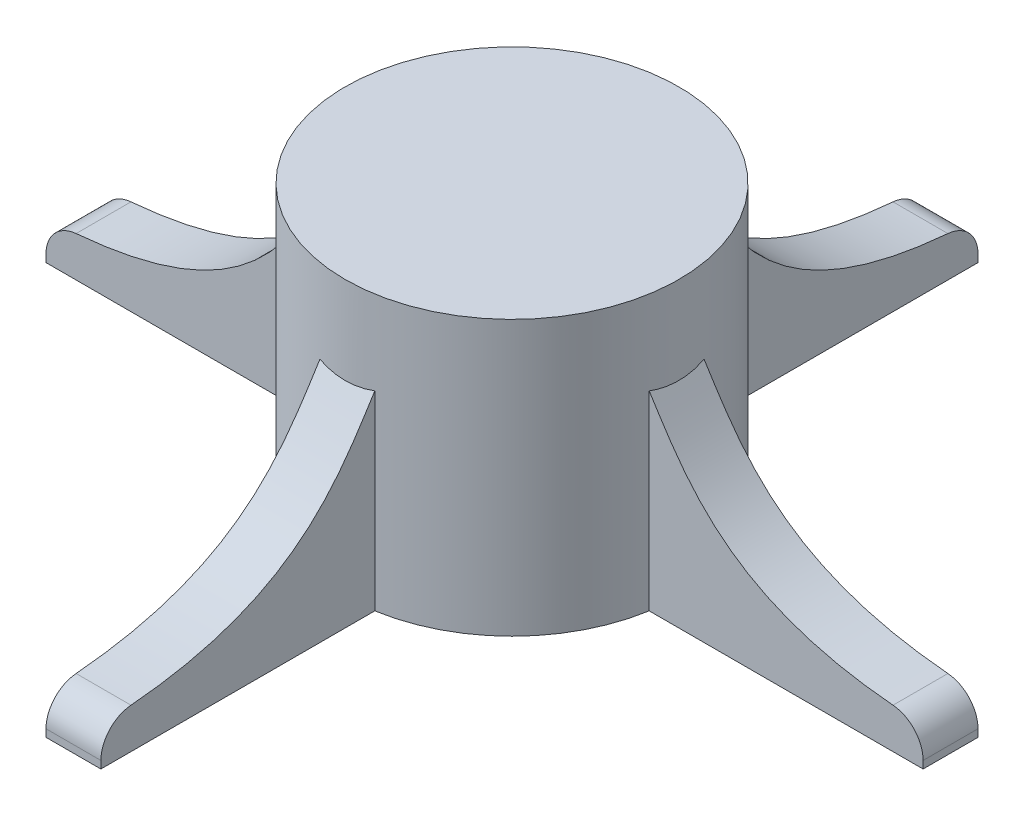
ISO-10303-21;
HEADER;
FILE_DESCRIPTION(('STEP AP214'),'2;1');
FILE_NAME('part.step','',(''),(''),'','','');
FILE_SCHEMA(('AUTOMOTIVE_DESIGN { 1 0 10303 214 1 1 1 1 }'));
ENDSEC;
DATA;
#1=APPLICATION_CONTEXT('core data for automotive mechanical design processes');
#2=APPLICATION_PROTOCOL_DEFINITION('international standard','automotive_design',2000,#1);
#3=PRODUCT_CONTEXT('',#1,'mechanical');
#4=PRODUCT('Part','Part','',(#3));
#5=PRODUCT_RELATED_PRODUCT_CATEGORY('part','',(#4));
#6=PRODUCT_DEFINITION_FORMATION('','',#4);
#7=PRODUCT_DEFINITION_CONTEXT('part definition',#1,'design');
#8=PRODUCT_DEFINITION('design','',#6,#7);
#9=PRODUCT_DEFINITION_SHAPE('','',#8);
#10=(LENGTH_UNIT() NAMED_UNIT(*) SI_UNIT(.MILLI.,.METRE.));
#11=(NAMED_UNIT(*) PLANE_ANGLE_UNIT() SI_UNIT($,.RADIAN.));
#12=(NAMED_UNIT(*) SI_UNIT($,.STERADIAN.) SOLID_ANGLE_UNIT());
#13=UNCERTAINTY_MEASURE_WITH_UNIT(LENGTH_MEASURE(1.E-05),#10,'distance_accuracy_value','');
#14=(GEOMETRIC_REPRESENTATION_CONTEXT(3) GLOBAL_UNCERTAINTY_ASSIGNED_CONTEXT((#13)) GLOBAL_UNIT_ASSIGNED_CONTEXT((#10,
#11,#12)) REPRESENTATION_CONTEXT('',''));
#15=CARTESIAN_POINT('',(0.,0.,0.));
#16=DIRECTION('',(0.,0.,1.));
#17=DIRECTION('',(1.,0.,0.));
#18=AXIS2_PLACEMENT_3D('',#15,#16,#17);
#19=CARTESIAN_POINT('',(2.5,25.,15.));
#20=DIRECTION('',(-1.,0.,0.));
#21=DIRECTION('',(0.,0.,1.));
#22=AXIS2_PLACEMENT_3D('',#19,#20,#21);
#23=PLANE('',#22);
#24=CARTESIAN_POINT('',(2.5,3.5,-39.9545926495664));
#25=CARTESIAN_POINT('',(2.5,4.59068781406489,-10.398907099997));
#26=CARTESIAN_POINT('',(2.5,25.7140022080052,-19.5925722624361));
#27=CARTESIAN_POINT('',(2.5,25.,-2.49999999999992));
#28=B_SPLINE_CURVE_WITH_KNOTS('',3,(#24,#25,#26,#27),.UNSPECIFIED.,.F.,.F.,(4,4),(0.,1.),.UNSPECIFIED.);
#29=CARTESIAN_POINT('',(2.5,3.66674252680247,-37.2124436125384));
#30=VERTEX_POINT('',#29);
#31=CARTESIAN_POINT('',(2.5,17.3573772006731,-15.));
#32=VERTEX_POINT('',#31);
#33=EDGE_CURVE('E495',#30,#32,#28,.T.);
#34=ORIENTED_EDGE('',*,*,#33,.T.);
#35=DIRECTION('',(0.,1.,0.));
#36=VECTOR('',#35,1.);
#37=CARTESIAN_POINT('',(2.5,-43.0116263352131,-15.));
#38=LINE('',#37,#36);
#39=CARTESIAN_POINT('',(2.5,0.,-15.));
#40=VERTEX_POINT('',#39);
#41=EDGE_CURVE('E442',#32,#40,#38,.F.);
#42=ORIENTED_EDGE('',*,*,#41,.T.);
#43=DIRECTION('',(0.,0.,-1.));
#44=VECTOR('',#43,1.);
#45=CARTESIAN_POINT('',(2.5,0.,0.));
#46=LINE('',#45,#44);
#47=CARTESIAN_POINT('',(2.5,0.,-39.9545926495664));
#48=VERTEX_POINT('',#47);
#49=EDGE_CURVE('E384',#40,#48,#46,.T.);
#50=ORIENTED_EDGE('',*,*,#49,.T.);
#51=DIRECTION('',(0.,1.,0.));
#52=VECTOR('',#51,1.);
#53=CARTESIAN_POINT('',(2.5,0.,-39.9545926495664));
#54=LINE('',#53,#52);
#55=CARTESIAN_POINT('',(2.5,0.677844254713842,-39.9545926495664));
#56=VERTEX_POINT('',#55);
#57=EDGE_CURVE('E496',#48,#56,#54,.T.);
#58=ORIENTED_EDGE('',*,*,#57,.T.);
#59=CARTESIAN_POINT('',(2.5,0.677844254713842,-36.9545926495664));
#60=DIRECTION('',(-1.,0.,0.));
#61=DIRECTION('',(0.,0.,1.));
#62=AXIS2_PLACEMENT_3D('',#59,#60,#61);
#63=CIRCLE('',#62,3.);
#64=EDGE_CURVE('E397',#56,#30,#63,.F.);
#65=ORIENTED_EDGE('',*,*,#64,.T.);
#66=EDGE_LOOP('',(#34,#42,#50,#58,#65));
#67=FACE_BOUND('',#66,.T.);
#68=ADVANCED_FACE('F137',(#67),#23,.F.);
#69=CARTESIAN_POINT('',(-2.5,25.,15.));
#70=DIRECTION('',(-1.,0.,0.));
#71=DIRECTION('',(0.,0.,1.));
#72=AXIS2_PLACEMENT_3D('',#69,#70,#71);
#73=PLANE('',#72);
#74=DIRECTION('',(0.,1.,0.));
#75=VECTOR('',#74,1.);
#76=CARTESIAN_POINT('',(-2.5,-43.0116263352131,-15.));
#77=LINE('',#76,#75);
#78=CARTESIAN_POINT('',(-2.5,17.3573772006731,-15.));
#79=VERTEX_POINT('',#78);
#80=CARTESIAN_POINT('',(-2.5,0.,-15.));
#81=VERTEX_POINT('',#80);
#82=EDGE_CURVE('E158',#79,#81,#77,.F.);
#83=ORIENTED_EDGE('',*,*,#82,.F.);
#84=CARTESIAN_POINT('',(-2.5,3.5,-39.9545926495664));
#85=CARTESIAN_POINT('',(-2.5,4.59068781406489,-10.398907099997));
#86=CARTESIAN_POINT('',(-2.5,25.7140022080052,-19.5925722624361));
#87=CARTESIAN_POINT('',(-2.5,25.,-2.49999999999992));
#88=B_SPLINE_CURVE_WITH_KNOTS('',3,(#84,#85,#86,#87),.UNSPECIFIED.,.F.,.F.,(4,4),(0.,1.),.UNSPECIFIED.);
#89=CARTESIAN_POINT('',(-2.5,3.66674252680247,-37.2124436125384));
#90=VERTEX_POINT('',#89);
#91=EDGE_CURVE('E506',#90,#79,#88,.T.);
#92=ORIENTED_EDGE('',*,*,#91,.F.);
#93=CARTESIAN_POINT('',(-2.5,0.677844254713842,-36.9545926495664));
#94=DIRECTION('',(-1.,0.,0.));
#95=DIRECTION('',(0.,0.,1.));
#96=AXIS2_PLACEMENT_3D('',#93,#94,#95);
#97=CIRCLE('',#96,3.);
#98=CARTESIAN_POINT('',(-2.5,0.677844254713842,-39.9545926495664));
#99=VERTEX_POINT('',#98);
#100=EDGE_CURVE('E401',#90,#99,#97,.T.);
#101=ORIENTED_EDGE('',*,*,#100,.T.);
#102=DIRECTION('',(0.,1.,0.));
#103=VECTOR('',#102,1.);
#104=CARTESIAN_POINT('',(-2.5,0.,-39.9545926495664));
#105=LINE('',#104,#103);
#106=CARTESIAN_POINT('',(-2.5,0.,-39.9545926495664));
#107=VERTEX_POINT('',#106);
#108=EDGE_CURVE('E513',#107,#99,#105,.T.);
#109=ORIENTED_EDGE('',*,*,#108,.F.);
#110=DIRECTION('',(0.,0.,-1.));
#111=VECTOR('',#110,1.);
#112=CARTESIAN_POINT('',(-2.5,0.,0.));
#113=LINE('',#112,#111);
#114=EDGE_CURVE('E376',#81,#107,#113,.T.);
#115=ORIENTED_EDGE('',*,*,#114,.F.);
#116=EDGE_LOOP('',(#83,#92,#101,#109,#115));
#117=FACE_BOUND('',#116,.T.);
#118=ADVANCED_FACE('F534',(#117),#73,.T.);
#119=CARTESIAN_POINT('',(-32.897536702704,3.5,-39.9545926495664));
#120=CARTESIAN_POINT('',(-32.897536702704,4.59068781406489,-10.398907099997));
#121=CARTESIAN_POINT('',(-32.897536702704,25.7140022080052,-19.5925722624361));
#122=CARTESIAN_POINT('',(-32.897536702704,25.,-2.49999999999992));
#123=B_SPLINE_CURVE_WITH_KNOTS('',3,(#119,#120,#121,#122),.UNSPECIFIED.,.F.,.F.,(4,4),(0.,1.),.UNSPECIFIED.);
#124=DIRECTION('',(1.,0.,0.));
#125=VECTOR('',#124,1.);
#126=SURFACE_OF_LINEAR_EXTRUSION('',#123,#125);
#127=CARTESIAN_POINT('',(2.5,17.3573772006731,-15.));
#128=CARTESIAN_POINT('',(2.38594080822945,17.327304853346,-15.0190104182561));
#129=CARTESIAN_POINT('',(2.27118348620852,17.2991487982736,-15.0367985522007));
#130=CARTESIAN_POINT('',(2.04039403774218,17.2468106078083,-15.0698502027806));
#131=CARTESIAN_POINT('',(1.92436177927692,17.2226288881755,-15.0851134552861));
#132=CARTESIAN_POINT('',(1.57450764038575,17.1562541437932,-15.1269977661233));
#133=CARTESIAN_POINT('',(1.33899036951968,17.1202479920447,-15.1497029835258));
#134=CARTESIAN_POINT('',(0.871251330223457,17.0663396874107,-15.1836922668583));
#135=CARTESIAN_POINT('',(0.639099915832391,17.0479969828594,-15.195254267149));
#136=CARTESIAN_POINT('',(0.173860365662943,17.0282659918208,-15.2076912416852));
#137=CARTESIAN_POINT('',(-0.0592273469786692,17.0268707562587,-15.2085705962016));
#138=CARTESIAN_POINT('',(-0.477178631381982,17.0395984028535,-15.2005481644292));
#139=CARTESIAN_POINT('',(-0.662184694852743,17.0506152310159,-15.1936041410884));
#140=CARTESIAN_POINT('',(-1.03090477507429,17.0832253641978,-15.1730461194627));
#141=CARTESIAN_POINT('',(-1.21461872114055,17.1048192433335,-15.1594317591157));
#142=CARTESIAN_POINT('',(-1.58376409334776,17.1588330245235,-15.1253675219848));
#143=CARTESIAN_POINT('',(-1.76915078213923,17.1914703968374,-15.1047803264042));
#144=CARTESIAN_POINT('',(-2.1369643075939,17.2669216288952,-15.0571537107689));
#145=CARTESIAN_POINT('',(-2.31939176548067,17.3097333224463,-15.0301156641462));
#146=CARTESIAN_POINT('',(-2.5,17.3573772006731,-15.));
#147=B_SPLINE_CURVE_WITH_KNOTS('',3,(#127,#128,#129,#130,#131,#132,#133,#134,#135,#136,#137,
#138,#139,#140,#141,#142,#143,#144,#145,#146),.UNSPECIFIED.,.F.,.F.,(4,2,2,2,2,2,2,2,2,4),(0.,
0.358389910484032,0.716817288748347,1.43386631910721,2.13252862783485,2.83090445008669,
3.38688531952755,3.94289637063593,4.51056385005341,5.07811057671948),.UNSPECIFIED.);
#148=EDGE_CURVE('E165',#32,#79,#147,.T.);
#149=ORIENTED_EDGE('',*,*,#148,.F.);
#150=ORIENTED_EDGE('',*,*,#33,.F.);
#151=DIRECTION('',(1.,0.,0.));
#152=VECTOR('',#151,1.);
#153=CARTESIAN_POINT('',(2.5,3.66674252680247,-37.2124436125384));
#154=LINE('',#153,#152);
#155=EDGE_CURVE('E399',#30,#90,#154,.F.);
#156=ORIENTED_EDGE('',*,*,#155,.T.);
#157=ORIENTED_EDGE('',*,*,#91,.T.);
#158=EDGE_LOOP('',(#149,#150,#156,#157));
#159=FACE_BOUND('',#158,.T.);
#160=ADVANCED_FACE('F530',(#159),#126,.T.);
#161=CARTESIAN_POINT('',(0.,0.,0.));
#162=DIRECTION('',(0.,1.,0.));
#163=DIRECTION('',(0.,0.,1.));
#164=AXIS2_PLACEMENT_3D('',#161,#162,#163);
#165=PLANE('',#164);
#166=ORIENTED_EDGE('',*,*,#49,.F.);
#167=CARTESIAN_POINT('',(0.,0.,0.));
#168=DIRECTION('',(0.,1.,0.));
#169=DIRECTION('',(0.,0.,1.));
#170=AXIS2_PLACEMENT_3D('',#167,#168,#169);
#171=CIRCLE('',#170,15.2069063257456);
#172=CARTESIAN_POINT('',(15.,0.,-2.50000000000005));
#173=VERTEX_POINT('',#172);
#174=EDGE_CURVE('E547',#40,#173,#171,.F.);
#175=ORIENTED_EDGE('',*,*,#174,.T.);
#176=DIRECTION('',(-1.,0.,0.));
#177=VECTOR('',#176,1.);
#178=CARTESIAN_POINT('',(0.,0.,-2.5));
#179=LINE('',#178,#177);
#180=CARTESIAN_POINT('',(39.9545926495664,0.,-2.50000000000014));
#181=VERTEX_POINT('',#180);
#182=EDGE_CURVE('E489',#181,#173,#179,.T.);
#183=ORIENTED_EDGE('',*,*,#182,.F.);
#184=DIRECTION('',(0.,0.,-1.));
#185=VECTOR('',#184,1.);
#186=CARTESIAN_POINT('',(39.9545926495665,0.,32.8975367027039));
#187=LINE('',#186,#185);
#188=CARTESIAN_POINT('',(39.9545926495664,0.,2.49999999999986));
#189=VERTEX_POINT('',#188);
#190=EDGE_CURVE('E291',#189,#181,#187,.T.);
#191=ORIENTED_EDGE('',*,*,#190,.F.);
#192=DIRECTION('',(-1.,0.,0.));
#193=VECTOR('',#192,1.);
#194=CARTESIAN_POINT('',(0.,0.,2.5));
#195=LINE('',#194,#193);
#196=CARTESIAN_POINT('',(15.,0.,2.49999999999995));
#197=VERTEX_POINT('',#196);
#198=EDGE_CURVE('E482',#189,#197,#195,.T.);
#199=ORIENTED_EDGE('',*,*,#198,.T.);
#200=CARTESIAN_POINT('',(2.5,0.,15.));
#201=VERTEX_POINT('',#200);
#202=EDGE_CURVE('E785',#197,#201,#171,.F.);
#203=ORIENTED_EDGE('',*,*,#202,.T.);
#204=CARTESIAN_POINT('',(2.5,0.,39.9545926495664));
#205=VERTEX_POINT('',#204);
#206=EDGE_CURVE('E385',#205,#201,#46,.T.);
#207=ORIENTED_EDGE('',*,*,#206,.F.);
#208=DIRECTION('',(1.,0.,0.));
#209=VECTOR('',#208,1.);
#210=CARTESIAN_POINT('',(-32.897536702704,0.,39.9545926495664));
#211=LINE('',#210,#209);
#212=CARTESIAN_POINT('',(-2.5,0.,39.9545926495664));
#213=VERTEX_POINT('',#212);
#214=EDGE_CURVE('E367',#213,#205,#211,.T.);
#215=ORIENTED_EDGE('',*,*,#214,.F.);
#216=CARTESIAN_POINT('',(-2.5,0.,15.));
#217=VERTEX_POINT('',#216);
#218=EDGE_CURVE('E378',#213,#217,#113,.T.);
#219=ORIENTED_EDGE('',*,*,#218,.T.);
#220=CARTESIAN_POINT('',(-15.,0.,2.50000000000005));
#221=VERTEX_POINT('',#220);
#222=EDGE_CURVE('E303',#217,#221,#171,.F.);
#223=ORIENTED_EDGE('',*,*,#222,.T.);
#224=CARTESIAN_POINT('',(-39.9545926495664,0.,2.50000000000014));
#225=VERTEX_POINT('',#224);
#226=EDGE_CURVE('E298',#221,#225,#195,.T.);
#227=ORIENTED_EDGE('',*,*,#226,.T.);
#228=DIRECTION('',(0.,0.,-1.));
#229=VECTOR('',#228,1.);
#230=CARTESIAN_POINT('',(-39.9545926495662,0.,32.8975367027041));
#231=LINE('',#230,#229);
#232=CARTESIAN_POINT('',(-39.9545926495664,0.,-2.49999999999986));
#233=VERTEX_POINT('',#232);
#234=EDGE_CURVE('E437',#225,#233,#231,.T.);
#235=ORIENTED_EDGE('',*,*,#234,.T.);
#236=CARTESIAN_POINT('',(-15.,0.,-2.49999999999995));
#237=VERTEX_POINT('',#236);
#238=EDGE_CURVE('E488',#237,#233,#179,.T.);
#239=ORIENTED_EDGE('',*,*,#238,.F.);
#240=EDGE_CURVE('E309',#237,#81,#171,.F.);
#241=ORIENTED_EDGE('',*,*,#240,.T.);
#242=ORIENTED_EDGE('',*,*,#114,.T.);
#243=DIRECTION('',(1.,0.,0.));
#244=VECTOR('',#243,1.);
#245=CARTESIAN_POINT('',(-32.897536702704,0.,-39.9545926495664));
#246=LINE('',#245,#244);
#247=EDGE_CURVE('E502',#107,#48,#246,.T.);
#248=ORIENTED_EDGE('',*,*,#247,.T.);
#249=EDGE_LOOP('',(#166,#175,#183,#191,#199,#203,#207,#215,#219,#223,#227,#235,#239,#241,#242,#248));
#250=FACE_BOUND('',#249,.T.);
#251=ADVANCED_FACE('F359',(#250),#165,.F.);
#252=ORIENTED_EDGE('',*,*,#206,.T.);
#253=DIRECTION('',(0.,1.,0.));
#254=VECTOR('',#253,1.);
#255=CARTESIAN_POINT('',(2.5,-43.0116263352131,15.));
#256=LINE('',#255,#254);
#257=CARTESIAN_POINT('',(2.5,17.3573772011945,14.9999999996704));
#258=VERTEX_POINT('',#257);
#259=EDGE_CURVE('E542',#201,#258,#256,.T.);
#260=ORIENTED_EDGE('',*,*,#259,.T.);
#261=CARTESIAN_POINT('',(2.5,3.5,39.9545926495664));
#262=CARTESIAN_POINT('',(2.5,4.59068781406489,10.398907099997));
#263=CARTESIAN_POINT('',(2.5,25.7140022080052,19.5925722624361));
#264=CARTESIAN_POINT('',(2.5,25.,2.49999999999992));
#265=B_SPLINE_CURVE_WITH_KNOTS('',3,(#261,#262,#263,#264),.UNSPECIFIED.,.F.,.F.,(4,4),(0.,1.),.UNSPECIFIED.);
#266=CARTESIAN_POINT('',(2.5,3.66674252680247,37.2124436125384));
#267=VERTEX_POINT('',#266);
#268=EDGE_CURVE('E369',#258,#267,#265,.F.);
#269=ORIENTED_EDGE('',*,*,#268,.T.);
#270=CARTESIAN_POINT('',(2.5,0.677844254713842,36.9545926495664));
#271=DIRECTION('',(-1.,0.,0.));
#272=DIRECTION('',(0.,0.,1.));
#273=AXIS2_PLACEMENT_3D('',#270,#271,#272);
#274=CIRCLE('',#273,3.);
#275=CARTESIAN_POINT('',(2.5,0.677844254713842,39.9545926495664));
#276=VERTEX_POINT('',#275);
#277=EDGE_CURVE('E416',#267,#276,#274,.F.);
#278=ORIENTED_EDGE('',*,*,#277,.T.);
#279=DIRECTION('',(0.,1.,0.));
#280=VECTOR('',#279,1.);
#281=CARTESIAN_POINT('',(2.5,0.,39.9545926495664));
#282=LINE('',#281,#280);
#283=EDGE_CURVE('E525',#205,#276,#282,.T.);
#284=ORIENTED_EDGE('',*,*,#283,.F.);
#285=EDGE_LOOP('',(#252,#260,#269,#278,#284));
#286=FACE_BOUND('',#285,.T.);
#287=ADVANCED_FACE('F535',(#286),#23,.F.);
#288=DIRECTION('',(0.,1.,0.));
#289=VECTOR('',#288,1.);
#290=CARTESIAN_POINT('',(-2.5,-43.0116263352131,15.));
#291=LINE('',#290,#289);
#292=CARTESIAN_POINT('',(-2.5,17.3573772006731,15.));
#293=VERTEX_POINT('',#292);
#294=EDGE_CURVE('E348',#217,#293,#291,.T.);
#295=ORIENTED_EDGE('',*,*,#294,.F.);
#296=ORIENTED_EDGE('',*,*,#218,.F.);
#297=DIRECTION('',(0.,1.,0.));
#298=VECTOR('',#297,1.);
#299=CARTESIAN_POINT('',(-2.5,0.,39.9545926495664));
#300=LINE('',#299,#298);
#301=CARTESIAN_POINT('',(-2.5,0.677844254713842,39.9545926495664));
#302=VERTEX_POINT('',#301);
#303=EDGE_CURVE('E377',#213,#302,#300,.T.);
#304=ORIENTED_EDGE('',*,*,#303,.T.);
#305=CARTESIAN_POINT('',(-2.5,0.677844254713842,36.9545926495664));
#306=DIRECTION('',(-1.,0.,0.));
#307=DIRECTION('',(0.,0.,1.));
#308=AXIS2_PLACEMENT_3D('',#305,#306,#307);
#309=CIRCLE('',#308,3.);
#310=CARTESIAN_POINT('',(-2.5,3.66674252680247,37.2124436125384));
#311=VERTEX_POINT('',#310);
#312=EDGE_CURVE('E420',#302,#311,#309,.T.);
#313=ORIENTED_EDGE('',*,*,#312,.T.);
#314=CARTESIAN_POINT('',(-2.5,3.5,39.9545926495664));
#315=CARTESIAN_POINT('',(-2.5,4.59068781406489,10.398907099997));
#316=CARTESIAN_POINT('',(-2.5,25.7140022080052,19.5925722624361));
#317=CARTESIAN_POINT('',(-2.5,25.,2.49999999999992));
#318=B_SPLINE_CURVE_WITH_KNOTS('',3,(#314,#315,#316,#317),.UNSPECIFIED.,.F.,.F.,(4,4),(0.,1.),.UNSPECIFIED.);
#319=EDGE_CURVE('E387',#293,#311,#318,.F.);
#320=ORIENTED_EDGE('',*,*,#319,.F.);
#321=EDGE_LOOP('',(#295,#296,#304,#313,#320));
#322=FACE_BOUND('',#321,.T.);
#323=ADVANCED_FACE('F357',(#322),#73,.T.);
#324=CARTESIAN_POINT('',(-15.,3.5,39.9545926495664));
#325=CARTESIAN_POINT('',(-15.,4.59068781406489,10.398907099997));
#326=CARTESIAN_POINT('',(-15.,25.7140022080052,19.5925722624361));
#327=CARTESIAN_POINT('',(-15.,25.,2.49999999999992));
#328=B_SPLINE_CURVE_WITH_KNOTS('',3,(#324,#325,#326,#327),.UNSPECIFIED.,.F.,.F.,(4,4),(0.,1.),.UNSPECIFIED.);
#329=DIRECTION('',(1.,0.,0.));
#330=VECTOR('',#329,1.);
#331=SURFACE_OF_LINEAR_EXTRUSION('',#328,#330);
#332=ORIENTED_EDGE('',*,*,#268,.F.);
#333=CARTESIAN_POINT('',(2.50000000197772,17.3573772011945,14.9999999996704));
#334=CARTESIAN_POINT('',(2.38594081021167,17.3273048538444,15.0190104179412));
#335=CARTESIAN_POINT('',(2.27118348819478,17.2991487987485,15.0367985519007));
#336=CARTESIAN_POINT('',(2.04039403973551,17.2468106082358,15.0698502025107));
#337=CARTESIAN_POINT('',(1.92436178127329,17.2226288885791,15.0851134550314));
#338=CARTESIAN_POINT('',(1.57450764238942,17.1562541441239,15.1269977659148));
#339=CARTESIAN_POINT('',(1.33899037152596,17.1202479923259,15.1497029833485));
#340=CARTESIAN_POINT('',(0.871251332232443,17.0663396875936,15.183692266743));
#341=CARTESIAN_POINT('',(0.639099917841623,17.0479969829934,15.1952542670646));
#342=CARTESIAN_POINT('',(0.173860367667687,17.0282659918571,15.2076912416623));
#343=CARTESIAN_POINT('',(-0.059227344978658,17.0268707562462,15.2085705962095));
#344=CARTESIAN_POINT('',(-0.477178629552696,17.0395984027593,15.2005481644886));
#345=CARTESIAN_POINT('',(-0.662184693188103,17.0506152308977,15.1936041411629));
#346=CARTESIAN_POINT('',(-1.03090477373903,17.0832253640507,15.1730461195554));
#347=CARTESIAN_POINT('',(-1.21461871997002,17.1048192431816,15.1594317592115));
#348=CARTESIAN_POINT('',(-1.58376409251266,17.1588330243815,15.1253675220744));
#349=CARTESIAN_POINT('',(-1.7691507814747,17.1914703967108,15.1047803264841));
#350=CARTESIAN_POINT('',(-2.13696430726573,17.2669216288182,15.0571537108176));
#351=CARTESIAN_POINT('',(-2.31939176531826,17.3097333224034,15.0301156641734));
#352=CARTESIAN_POINT('',(-2.5,17.3573772006731,15.));
#353=B_SPLINE_CURVE_WITH_KNOTS('',3,(#333,#334,#335,#336,#337,#338,#339,#340,#341,#342,#343,
#344,#345,#346,#347,#348,#349,#350,#351,#352),.UNSPECIFIED.,.F.,.F.,(4,2,2,2,2,2,2,2,2,4),(0.,
0.358389910495596,0.71681728877151,1.43386631915402,2.13252862789706,2.83090445016437,
3.38688532009078,3.94289637168516,4.51056385161361,5.07811057879007),.UNSPECIFIED.);
#354=EDGE_CURVE('E341',#258,#293,#353,.T.);
#355=ORIENTED_EDGE('',*,*,#354,.T.);
#356=ORIENTED_EDGE('',*,*,#319,.T.);
#357=DIRECTION('',(1.,0.,0.));
#358=VECTOR('',#357,1.);
#359=CARTESIAN_POINT('',(-2.5,3.66674252680247,37.2124436125384));
#360=LINE('',#359,#358);
#361=EDGE_CURVE('E413',#311,#267,#360,.T.);
#362=ORIENTED_EDGE('',*,*,#361,.T.);
#363=EDGE_LOOP('',(#332,#355,#356,#362));
#364=FACE_BOUND('',#363,.T.);
#365=ADVANCED_FACE('F350',(#364),#331,.F.);
#366=CARTESIAN_POINT('',(-32.897536702704,0.,39.9545926495664));
#367=DIRECTION('',(0.,0.,-1.));
#368=DIRECTION('',(-1.,0.,0.));
#369=AXIS2_PLACEMENT_3D('',#366,#367,#368);
#370=PLANE('',#369);
#371=ORIENTED_EDGE('',*,*,#283,.T.);
#372=DIRECTION('',(1.,0.,0.));
#373=VECTOR('',#372,1.);
#374=CARTESIAN_POINT('',(-32.897536702704,0.677844254713842,39.9545926495664));
#375=LINE('',#374,#373);
#376=EDGE_CURVE('E418',#276,#302,#375,.F.);
#377=ORIENTED_EDGE('',*,*,#376,.T.);
#378=ORIENTED_EDGE('',*,*,#303,.F.);
#379=ORIENTED_EDGE('',*,*,#214,.T.);
#380=EDGE_LOOP('',(#371,#377,#378,#379));
#381=FACE_BOUND('',#380,.T.);
#382=ADVANCED_FACE('F356',(#381),#370,.F.);
#383=CARTESIAN_POINT('',(-32.897536702704,0.,-39.9545926495664));
#384=DIRECTION('',(0.,0.,-1.));
#385=DIRECTION('',(-1.,0.,0.));
#386=AXIS2_PLACEMENT_3D('',#383,#384,#385);
#387=PLANE('',#386);
#388=ORIENTED_EDGE('',*,*,#108,.T.);
#389=DIRECTION('',(1.,0.,0.));
#390=VECTOR('',#389,1.);
#391=CARTESIAN_POINT('',(-32.897536702704,0.677844254713842,-39.9545926495664));
#392=LINE('',#391,#390);
#393=EDGE_CURVE('E391',#99,#56,#392,.T.);
#394=ORIENTED_EDGE('',*,*,#393,.T.);
#395=ORIENTED_EDGE('',*,*,#57,.F.);
#396=ORIENTED_EDGE('',*,*,#247,.F.);
#397=EDGE_LOOP('',(#388,#394,#395,#396));
#398=FACE_BOUND('',#397,.T.);
#399=ADVANCED_FACE('F536',(#398),#387,.T.);
#400=CARTESIAN_POINT('',(39.9545926495665,0.,32.8975367027039));
#401=DIRECTION('',(-1.,0.,0.));
#402=DIRECTION('',(0.,0.,1.));
#403=AXIS2_PLACEMENT_3D('',#400,#401,#402);
#404=PLANE('',#403);
#405=DIRECTION('',(0.,1.,0.));
#406=VECTOR('',#405,1.);
#407=CARTESIAN_POINT('',(39.9545926495664,0.,-2.50000000000014));
#408=LINE('',#407,#406);
#409=CARTESIAN_POINT('',(39.9545926495664,0.677844254713842,-2.50000000000014));
#410=VERTEX_POINT('',#409);
#411=EDGE_CURVE('E461',#181,#410,#408,.T.);
#412=ORIENTED_EDGE('',*,*,#411,.T.);
#413=DIRECTION('',(0.,0.,-1.));
#414=VECTOR('',#413,1.);
#415=CARTESIAN_POINT('',(39.9545926495665,0.677844254713842,32.8975367027039));
#416=LINE('',#415,#414);
#417=CARTESIAN_POINT('',(39.9545926495664,0.677844254713842,2.49999999999986));
#418=VERTEX_POINT('',#417);
#419=EDGE_CURVE('E408',#410,#418,#416,.F.);
#420=ORIENTED_EDGE('',*,*,#419,.T.);
#421=DIRECTION('',(0.,1.,0.));
#422=VECTOR('',#421,1.);
#423=CARTESIAN_POINT('',(39.9545926495664,0.,2.49999999999986));
#424=LINE('',#423,#422);
#425=EDGE_CURVE('E467',#189,#418,#424,.T.);
#426=ORIENTED_EDGE('',*,*,#425,.F.);
#427=ORIENTED_EDGE('',*,*,#190,.T.);
#428=EDGE_LOOP('',(#412,#420,#426,#427));
#429=FACE_BOUND('',#428,.T.);
#430=ADVANCED_FACE('F608',(#429),#404,.F.);
#431=CARTESIAN_POINT('',(39.9545926495664,3.5,14.9999999999999));
#432=CARTESIAN_POINT('',(10.3989070999971,4.59068781406489,15.));
#433=CARTESIAN_POINT('',(19.5925722624361,25.7140022080052,14.9999999999999));
#434=CARTESIAN_POINT('',(2.49999999999998,25.,15.));
#435=B_SPLINE_CURVE_WITH_KNOTS('',3,(#431,#432,#433,#434),.UNSPECIFIED.,.F.,.F.,(4,4),(0.,1.),.UNSPECIFIED.);
#436=DIRECTION('',(0.,0.,-1.));
#437=VECTOR('',#436,1.);
#438=SURFACE_OF_LINEAR_EXTRUSION('',#435,#437);
#439=CARTESIAN_POINT('',(39.9545926495664,3.5,-2.50000000000014));
#440=CARTESIAN_POINT('',(10.398907099997,4.59068781406489,-2.50000000000004));
#441=CARTESIAN_POINT('',(19.5925722624361,25.7140022080052,-2.50000000000007));
#442=CARTESIAN_POINT('',(2.49999999999991,25.,-2.50000000000001));
#443=B_SPLINE_CURVE_WITH_KNOTS('',3,(#439,#440,#441,#442),.UNSPECIFIED.,.F.,.F.,(4,4),(0.,1.),.UNSPECIFIED.);
#444=CARTESIAN_POINT('',(14.999999995182,17.3573772082944,-2.50000000000005));
#445=VERTEX_POINT('',#444);
#446=CARTESIAN_POINT('',(37.2124436125384,3.66674252680247,-2.50000000000013));
#447=VERTEX_POINT('',#446);
#448=EDGE_CURVE('E470',#445,#447,#443,.F.);
#449=ORIENTED_EDGE('',*,*,#448,.F.);
#450=CARTESIAN_POINT('',(15.,17.3573772006731,-2.50000000000005));
#451=CARTESIAN_POINT('',(15.0190104182561,17.327304853346,-2.38594080822951));
#452=CARTESIAN_POINT('',(15.0367985522007,17.2991487982736,-2.27118348620858));
#453=CARTESIAN_POINT('',(15.0698502027806,17.2468106078083,-2.04039403774224));
#454=CARTESIAN_POINT('',(15.0851134552861,17.2226288881755,-1.92436177927698));
#455=CARTESIAN_POINT('',(15.1269977661233,17.1562541437932,-1.57450764038581));
#456=CARTESIAN_POINT('',(15.1497029835258,17.1202479920447,-1.33899036951974));
#457=CARTESIAN_POINT('',(15.1836922668583,17.0663396874107,-0.871251330223521));
#458=CARTESIAN_POINT('',(15.195254267149,17.0479969828594,-0.639099915832456));
#459=CARTESIAN_POINT('',(15.2076912416852,17.0282659918208,-0.173860365663009));
#460=CARTESIAN_POINT('',(15.2085705962016,17.0268707562587,0.0592273469786026));
#461=CARTESIAN_POINT('',(15.2005481644292,17.0395984028535,0.477178631381916));
#462=CARTESIAN_POINT('',(15.1936041410884,17.0506152310159,0.662184694852678));
#463=CARTESIAN_POINT('',(15.1730461194627,17.0832253641978,1.03090477507422));
#464=CARTESIAN_POINT('',(15.1594317591157,17.1048192433335,1.21461872114049));
#465=CARTESIAN_POINT('',(15.1253675219848,17.1588330245235,1.58376409334771));
#466=CARTESIAN_POINT('',(15.1047803264042,17.1914703968374,1.76915078213917));
#467=CARTESIAN_POINT('',(15.0571537107689,17.2669216288953,2.13696430759385));
#468=CARTESIAN_POINT('',(15.0301156641462,17.3097333224464,2.31939176548062));
#469=CARTESIAN_POINT('',(15.,17.3573772006731,2.49999999999995));
#470=B_SPLINE_CURVE_WITH_KNOTS('',3,(#450,#451,#452,#453,#454,#455,#456,#457,#458,#459,#460,
#461,#462,#463,#464,#465,#466,#467,#468,#469),.UNSPECIFIED.,.F.,.F.,(4,2,2,2,2,2,2,2,2,4),(0.,
0.35838991048403,0.716817288748344,1.4338663191072,2.13252862783485,2.83090445008668,
3.38688531952755,3.94289637063593,4.51056385005341,5.07811057671949),.UNSPECIFIED.);
#471=CARTESIAN_POINT('',(14.9999999983802,17.3573772032354,2.49999999999995));
#472=VERTEX_POINT('',#471);
#473=EDGE_CURVE('E314',#445,#472,#470,.T.);
#474=ORIENTED_EDGE('',*,*,#473,.T.);
#475=CARTESIAN_POINT('',(39.9545926495664,3.5,2.49999999999986));
#476=CARTESIAN_POINT('',(10.398907099997,4.59068781406489,2.49999999999997));
#477=CARTESIAN_POINT('',(19.5925722624361,25.7140022080052,2.49999999999993));
#478=CARTESIAN_POINT('',(2.49999999999993,25.,2.49999999999999));
#479=B_SPLINE_CURVE_WITH_KNOTS('',3,(#475,#476,#477,#478),.UNSPECIFIED.,.F.,.F.,(4,4),(0.,1.),.UNSPECIFIED.);
#480=CARTESIAN_POINT('',(37.2124436125384,3.66674252680247,2.49999999999987));
#481=VERTEX_POINT('',#480);
#482=EDGE_CURVE('E491',#472,#481,#479,.F.);
#483=ORIENTED_EDGE('',*,*,#482,.T.);
#484=DIRECTION('',(0.,0.,-1.));
#485=VECTOR('',#484,1.);
#486=CARTESIAN_POINT('',(37.2124436125384,3.66674252680247,2.49999999999987));
#487=LINE('',#486,#485);
#488=EDGE_CURVE('E403',#481,#447,#487,.T.);
#489=ORIENTED_EDGE('',*,*,#488,.T.);
#490=EDGE_LOOP('',(#449,#474,#483,#489));
#491=FACE_BOUND('',#490,.T.);
#492=ADVANCED_FACE('F326',(#491),#438,.F.);
#493=CARTESIAN_POINT('',(15.,25.,2.49999999999995));
#494=DIRECTION('',(0.,0.,1.));
#495=DIRECTION('',(1.,0.,0.));
#496=AXIS2_PLACEMENT_3D('',#493,#494,#495);
#497=PLANE('',#496);
#498=DIRECTION('',(0.,1.,0.));
#499=VECTOR('',#498,1.);
#500=CARTESIAN_POINT('',(15.,-43.0116263352131,2.49999999999995));
#501=LINE('',#500,#499);
#502=EDGE_CURVE('E324',#197,#472,#501,.T.);
#503=ORIENTED_EDGE('',*,*,#502,.F.);
#504=ORIENTED_EDGE('',*,*,#198,.F.);
#505=ORIENTED_EDGE('',*,*,#425,.T.);
#506=CARTESIAN_POINT('',(36.9545926495664,0.677844254713842,2.49999999999987));
#507=DIRECTION('',(0.,0.,1.));
#508=DIRECTION('',(1.,0.,0.));
#509=AXIS2_PLACEMENT_3D('',#506,#507,#508);
#510=CIRCLE('',#509,3.);
#511=EDGE_CURVE('E410',#418,#481,#510,.T.);
#512=ORIENTED_EDGE('',*,*,#511,.T.);
#513=ORIENTED_EDGE('',*,*,#482,.F.);
#514=EDGE_LOOP('',(#503,#504,#505,#512,#513));
#515=FACE_BOUND('',#514,.T.);
#516=ADVANCED_FACE('F607',(#515),#497,.T.);
#517=CARTESIAN_POINT('',(15.,25.,-2.50000000000005));
#518=DIRECTION('',(0.,0.,1.));
#519=DIRECTION('',(1.,0.,0.));
#520=AXIS2_PLACEMENT_3D('',#517,#518,#519);
#521=PLANE('',#520);
#522=ORIENTED_EDGE('',*,*,#182,.T.);
#523=DIRECTION('',(0.,1.,0.));
#524=VECTOR('',#523,1.);
#525=CARTESIAN_POINT('',(15.,-43.0116263352131,-2.50000000000005));
#526=LINE('',#525,#524);
#527=EDGE_CURVE('E312',#173,#445,#526,.T.);
#528=ORIENTED_EDGE('',*,*,#527,.T.);
#529=ORIENTED_EDGE('',*,*,#448,.T.);
#530=CARTESIAN_POINT('',(36.9545926495664,0.677844254713842,-2.50000000000013));
#531=DIRECTION('',(0.,0.,1.));
#532=DIRECTION('',(1.,0.,0.));
#533=AXIS2_PLACEMENT_3D('',#530,#531,#532);
#534=CIRCLE('',#533,3.);
#535=EDGE_CURVE('E406',#447,#410,#534,.F.);
#536=ORIENTED_EDGE('',*,*,#535,.T.);
#537=ORIENTED_EDGE('',*,*,#411,.F.);
#538=EDGE_LOOP('',(#522,#528,#529,#536,#537));
#539=FACE_BOUND('',#538,.T.);
#540=ADVANCED_FACE('F620',(#539),#521,.F.);
#541=CARTESIAN_POINT('',(-39.9545926495664,3.5,-2.49999999999986));
#542=CARTESIAN_POINT('',(-10.398907099997,4.59068781406489,-2.49999999999996));
#543=CARTESIAN_POINT('',(-19.5925722624361,25.7140022080052,-2.49999999999993));
#544=CARTESIAN_POINT('',(-2.49999999999993,25.,-2.49999999999999));
#545=B_SPLINE_CURVE_WITH_KNOTS('',3,(#541,#542,#543,#544),.UNSPECIFIED.,.F.,.F.,(4,4),(0.,1.),.UNSPECIFIED.);
#546=CARTESIAN_POINT('',(-37.2124436125384,3.66674252680247,-2.49999999999987));
#547=VERTEX_POINT('',#546);
#548=CARTESIAN_POINT('',(-15.,17.3573772006731,-2.49999999999995));
#549=VERTEX_POINT('',#548);
#550=EDGE_CURVE('E440',#547,#549,#545,.T.);
#551=ORIENTED_EDGE('',*,*,#550,.T.);
#552=DIRECTION('',(0.,1.,0.));
#553=VECTOR('',#552,1.);
#554=CARTESIAN_POINT('',(-15.,-43.0116263352131,-2.49999999999995));
#555=LINE('',#554,#553);
#556=EDGE_CURVE('E302',#549,#237,#555,.F.);
#557=ORIENTED_EDGE('',*,*,#556,.T.);
#558=ORIENTED_EDGE('',*,*,#238,.T.);
#559=DIRECTION('',(0.,1.,0.));
#560=VECTOR('',#559,1.);
#561=CARTESIAN_POINT('',(-39.9545926495664,0.,-2.49999999999986));
#562=LINE('',#561,#560);
#563=CARTESIAN_POINT('',(-39.9545926495664,0.677844254713841,-2.49999999999986));
#564=VERTEX_POINT('',#563);
#565=EDGE_CURVE('E441',#233,#564,#562,.T.);
#566=ORIENTED_EDGE('',*,*,#565,.T.);
#567=CARTESIAN_POINT('',(-36.9545926495664,0.677844254713841,-2.49999999999987));
#568=DIRECTION('',(0.,0.,1.));
#569=DIRECTION('',(1.,0.,0.));
#570=AXIS2_PLACEMENT_3D('',#567,#568,#569);
#571=CIRCLE('',#570,3.);
#572=EDGE_CURVE('E426',#564,#547,#571,.F.);
#573=ORIENTED_EDGE('',*,*,#572,.T.);
#574=EDGE_LOOP('',(#551,#557,#558,#566,#573));
#575=FACE_BOUND('',#574,.T.);
#576=ADVANCED_FACE('F439',(#575),#521,.F.);
#577=DIRECTION('',(0.,1.,0.));
#578=VECTOR('',#577,1.);
#579=CARTESIAN_POINT('',(-15.,-43.0116263352131,2.50000000000005));
#580=LINE('',#579,#578);
#581=CARTESIAN_POINT('',(-15.,17.3573772006731,2.50000000000007));
#582=VERTEX_POINT('',#581);
#583=EDGE_CURVE('E295',#582,#221,#580,.F.);
#584=ORIENTED_EDGE('',*,*,#583,.F.);
#585=CARTESIAN_POINT('',(-39.9545926495664,3.5,2.50000000000014));
#586=CARTESIAN_POINT('',(-10.398907099997,4.59068781406489,2.50000000000004));
#587=CARTESIAN_POINT('',(-19.5925722624361,25.7140022080052,2.50000000000007));
#588=CARTESIAN_POINT('',(-2.49999999999991,25.,2.50000000000001));
#589=B_SPLINE_CURVE_WITH_KNOTS('',3,(#585,#586,#587,#588),.UNSPECIFIED.,.F.,.F.,(4,4),(0.,1.),.UNSPECIFIED.);
#590=CARTESIAN_POINT('',(-37.2124436125384,3.66674252680247,2.50000000000013));
#591=VERTEX_POINT('',#590);
#592=EDGE_CURVE('E282',#591,#582,#589,.T.);
#593=ORIENTED_EDGE('',*,*,#592,.F.);
#594=CARTESIAN_POINT('',(-36.9545926495664,0.677844254713841,2.50000000000013));
#595=DIRECTION('',(0.,0.,1.));
#596=DIRECTION('',(1.,0.,0.));
#597=AXIS2_PLACEMENT_3D('',#594,#595,#596);
#598=CIRCLE('',#597,3.);
#599=CARTESIAN_POINT('',(-39.9545926495664,0.677844254713841,2.50000000000014));
#600=VERTEX_POINT('',#599);
#601=EDGE_CURVE('E151',#591,#600,#598,.T.);
#602=ORIENTED_EDGE('',*,*,#601,.T.);
#603=DIRECTION('',(0.,1.,0.));
#604=VECTOR('',#603,1.);
#605=CARTESIAN_POINT('',(-39.9545926495664,0.,2.50000000000014));
#606=LINE('',#605,#604);
#607=EDGE_CURVE('E292',#225,#600,#606,.T.);
#608=ORIENTED_EDGE('',*,*,#607,.F.);
#609=ORIENTED_EDGE('',*,*,#226,.F.);
#610=EDGE_LOOP('',(#584,#593,#602,#608,#609));
#611=FACE_BOUND('',#610,.T.);
#612=ADVANCED_FACE('F296',(#611),#497,.T.);
#613=CARTESIAN_POINT('',(-39.9545926495662,0.,32.8975367027041));
#614=DIRECTION('',(-1.,0.,0.));
#615=DIRECTION('',(0.,0.,1.));
#616=AXIS2_PLACEMENT_3D('',#613,#614,#615);
#617=PLANE('',#616);
#618=ORIENTED_EDGE('',*,*,#607,.T.);
#619=DIRECTION('',(0.,0.,-1.));
#620=VECTOR('',#619,1.);
#621=CARTESIAN_POINT('',(-39.9545926495662,0.677844254713841,32.8975367027041));
#622=LINE('',#621,#620);
#623=EDGE_CURVE('E423',#600,#564,#622,.T.);
#624=ORIENTED_EDGE('',*,*,#623,.T.);
#625=ORIENTED_EDGE('',*,*,#565,.F.);
#626=ORIENTED_EDGE('',*,*,#234,.F.);
#627=EDGE_LOOP('',(#618,#624,#625,#626));
#628=FACE_BOUND('',#627,.T.);
#629=ADVANCED_FACE('F433',(#628),#617,.T.);
#630=CARTESIAN_POINT('',(-39.9545926495662,3.5,32.8975367027041));
#631=CARTESIAN_POINT('',(-10.3989070999969,4.59068781406489,32.897536702704));
#632=CARTESIAN_POINT('',(-19.592572262436,25.7140022080052,32.8975367027041));
#633=CARTESIAN_POINT('',(-2.49999999999981,25.,32.897536702704));
#634=B_SPLINE_CURVE_WITH_KNOTS('',3,(#630,#631,#632,#633),.UNSPECIFIED.,.F.,.F.,(4,4),(0.,1.),.UNSPECIFIED.);
#635=DIRECTION('',(0.,0.,-1.));
#636=VECTOR('',#635,1.);
#637=SURFACE_OF_LINEAR_EXTRUSION('',#634,#636);
#638=CARTESIAN_POINT('',(-15.,17.3573772006731,-2.49999999999996));
#639=CARTESIAN_POINT('',(-15.0190104182561,17.327304853346,-2.38594080822941));
#640=CARTESIAN_POINT('',(-15.0367985522007,17.2991487982736,-2.27118348620848));
#641=CARTESIAN_POINT('',(-15.0698502027806,17.2468106078083,-2.04039403774214));
#642=CARTESIAN_POINT('',(-15.0851134552861,17.2226288881755,-1.92436177927688));
#643=CARTESIAN_POINT('',(-15.1269977661233,17.1562541437932,-1.57450764038572));
#644=CARTESIAN_POINT('',(-15.1497029835258,17.1202479920447,-1.33899036951965));
#645=CARTESIAN_POINT('',(-15.1836922668583,17.0663396874107,-0.871251330223429));
#646=CARTESIAN_POINT('',(-15.195254267149,17.0479969828594,-0.639099915832364));
#647=CARTESIAN_POINT('',(-15.2076912416852,17.0282659918208,-0.173860365662919));
#648=CARTESIAN_POINT('',(-15.2085705962016,17.0268707562587,0.0592273469786914));
#649=CARTESIAN_POINT('',(-15.2005481644292,17.0395984028535,0.477178631382007));
#650=CARTESIAN_POINT('',(-15.1936041410884,17.0506152310159,0.662184694852772));
#651=CARTESIAN_POINT('',(-15.1730461194627,17.0832253641977,1.03090477507432));
#652=CARTESIAN_POINT('',(-15.1594317591157,17.1048192433335,1.21461872114059));
#653=CARTESIAN_POINT('',(-15.1253675219848,17.1588330245235,1.58376409334781));
#654=CARTESIAN_POINT('',(-15.1047803264042,17.1914703968374,1.76915078213928));
#655=CARTESIAN_POINT('',(-15.0571537107689,17.2669216288952,2.13696430759396));
#656=CARTESIAN_POINT('',(-15.0301156641462,17.3097333224463,2.31939176548073));
#657=CARTESIAN_POINT('',(-15.,17.3573772006731,2.50000000000007));
#658=B_SPLINE_CURVE_WITH_KNOTS('',3,(#638,#639,#640,#641,#642,#643,#644,#645,#646,#647,#648,
#649,#650,#651,#652,#653,#654,#655,#656,#657),.UNSPECIFIED.,.F.,.F.,(4,2,2,2,2,2,2,2,2,4),(0.,
0.358389910484029,0.716817288748342,1.4338663191072,2.13252862783484,2.83090445008667,
3.38688531952755,3.94289637063594,4.51056385005342,5.07811057671951),.UNSPECIFIED.);
#659=EDGE_CURVE('E12',#549,#582,#658,.T.);
#660=ORIENTED_EDGE('',*,*,#659,.F.);
#661=ORIENTED_EDGE('',*,*,#550,.F.);
#662=DIRECTION('',(0.,0.,-1.));
#663=VECTOR('',#662,1.);
#664=CARTESIAN_POINT('',(-37.2124436125384,3.66674252680247,-2.49999999999987));
#665=LINE('',#664,#663);
#666=EDGE_CURVE('E288',#547,#591,#665,.F.);
#667=ORIENTED_EDGE('',*,*,#666,.T.);
#668=ORIENTED_EDGE('',*,*,#592,.T.);
#669=EDGE_LOOP('',(#660,#661,#667,#668));
#670=FACE_BOUND('',#669,.T.);
#671=ADVANCED_FACE('F284',(#670),#637,.T.);
#672=CARTESIAN_POINT('',(0.,0.677844254713842,-36.9545926495664));
#673=DIRECTION('',(1.,0.,0.));
#674=DIRECTION('',(0.,0.,-1.));
#675=AXIS2_PLACEMENT_3D('',#672,#673,#674);
#676=CYLINDRICAL_SURFACE('',#675,3.);
#677=ORIENTED_EDGE('',*,*,#100,.F.);
#678=ORIENTED_EDGE('',*,*,#155,.F.);
#679=ORIENTED_EDGE('',*,*,#64,.F.);
#680=ORIENTED_EDGE('',*,*,#393,.F.);
#681=EDGE_LOOP('',(#677,#678,#679,#680));
#682=FACE_BOUND('',#681,.T.);
#683=ADVANCED_FACE('F559',(#682),#676,.T.);
#684=CARTESIAN_POINT('',(36.9545926495664,0.677844254713842,-1.27469255396864E-13));
#685=DIRECTION('',(0.,0.,-1.));
#686=DIRECTION('',(-1.,0.,0.));
#687=AXIS2_PLACEMENT_3D('',#684,#685,#686);
#688=CYLINDRICAL_SURFACE('',#687,3.);
#689=ORIENTED_EDGE('',*,*,#511,.F.);
#690=ORIENTED_EDGE('',*,*,#419,.F.);
#691=ORIENTED_EDGE('',*,*,#535,.F.);
#692=ORIENTED_EDGE('',*,*,#488,.F.);
#693=EDGE_LOOP('',(#689,#690,#691,#692));
#694=FACE_BOUND('',#693,.T.);
#695=ADVANCED_FACE('F702',(#694),#688,.T.);
#696=CARTESIAN_POINT('',(0.,0.677844254713842,36.9545926495664));
#697=DIRECTION('',(1.,0.,0.));
#698=DIRECTION('',(0.,0.,-1.));
#699=AXIS2_PLACEMENT_3D('',#696,#697,#698);
#700=CYLINDRICAL_SURFACE('',#699,3.);
#701=ORIENTED_EDGE('',*,*,#312,.F.);
#702=ORIENTED_EDGE('',*,*,#376,.F.);
#703=ORIENTED_EDGE('',*,*,#277,.F.);
#704=ORIENTED_EDGE('',*,*,#361,.F.);
#705=EDGE_LOOP('',(#701,#702,#703,#704));
#706=FACE_BOUND('',#705,.T.);
#707=ADVANCED_FACE('F711',(#706),#700,.T.);
#708=CARTESIAN_POINT('',(-36.9545926495664,0.677844254713841,1.37877596252725E-13));
#709=DIRECTION('',(0.,0.,-1.));
#710=DIRECTION('',(-1.,0.,0.));
#711=AXIS2_PLACEMENT_3D('',#708,#709,#710);
#712=CYLINDRICAL_SURFACE('',#711,3.);
#713=ORIENTED_EDGE('',*,*,#601,.F.);
#714=ORIENTED_EDGE('',*,*,#666,.F.);
#715=ORIENTED_EDGE('',*,*,#572,.F.);
#716=ORIENTED_EDGE('',*,*,#623,.F.);
#717=EDGE_LOOP('',(#713,#714,#715,#716));
#718=FACE_BOUND('',#717,.T.);
#719=ADVANCED_FACE('F139',(#718),#712,.T.);
#720=CARTESIAN_POINT('',(0.,-43.0116263352131,0.));
#721=DIRECTION('',(0.,1.,0.));
#722=DIRECTION('',(0.,0.,1.));
#723=AXIS2_PLACEMENT_3D('',#720,#721,#722);
#724=CYLINDRICAL_SURFACE('',#723,15.2069063257456);
#725=ORIENTED_EDGE('',*,*,#240,.F.);
#726=ORIENTED_EDGE('',*,*,#556,.F.);
#727=ORIENTED_EDGE('',*,*,#659,.T.);
#728=ORIENTED_EDGE('',*,*,#583,.T.);
#729=ORIENTED_EDGE('',*,*,#222,.F.);
#730=ORIENTED_EDGE('',*,*,#294,.T.);
#731=ORIENTED_EDGE('',*,*,#354,.F.);
#732=ORIENTED_EDGE('',*,*,#259,.F.);
#733=ORIENTED_EDGE('',*,*,#202,.F.);
#734=ORIENTED_EDGE('',*,*,#502,.T.);
#735=ORIENTED_EDGE('',*,*,#473,.F.);
#736=ORIENTED_EDGE('',*,*,#527,.F.);
#737=ORIENTED_EDGE('',*,*,#174,.F.);
#738=ORIENTED_EDGE('',*,*,#41,.F.);
#739=ORIENTED_EDGE('',*,*,#148,.T.);
#740=ORIENTED_EDGE('',*,*,#82,.T.);
#741=EDGE_LOOP('',(#725,#726,#727,#728,#729,#730,#731,#732,#733,#734,#735,#736,#737,#738,#739,#740));
#742=FACE_BOUND('',#741,.T.);
#743=CARTESIAN_POINT('',(0.,25.,0.));
#744=DIRECTION('',(0.,1.,0.));
#745=DIRECTION('',(0.,0.,1.));
#746=AXIS2_PLACEMENT_3D('',#743,#744,#745);
#747=CIRCLE('',#746,15.2069063257456);
#748=CARTESIAN_POINT('',(0.,25.,15.2069063257456));
#749=VERTEX_POINT('',#748);
#750=EDGE_CURVE('E787',#749,#749,#747,.T.);
#751=ORIENTED_EDGE('',*,*,#750,.F.);
#752=EDGE_LOOP('',(#751));
#753=FACE_BOUND('',#752,.T.);
#754=ADVANCED_FACE('F306',(#742,#753),#724,.T.);
#755=CARTESIAN_POINT('',(0.,25.,0.));
#756=DIRECTION('',(0.,1.,0.));
#757=DIRECTION('',(0.,0.,1.));
#758=AXIS2_PLACEMENT_3D('',#755,#756,#757);
#759=PLANE('',#758);
#760=ORIENTED_EDGE('',*,*,#750,.T.);
#761=EDGE_LOOP('',(#760));
#762=FACE_BOUND('',#761,.T.);
#763=ADVANCED_FACE('F333',(#762),#759,.T.);
#764=CLOSED_SHELL('',(#68,#118,#160,#251,#287,#323,#365,#382,#399,#430,#492,#516,#540,#576,#612,
#629,#671,#683,#695,#707,#719,#754,#763));
#765=MANIFOLD_SOLID_BREP('B2',#764);
#766=ADVANCED_BREP_SHAPE_REPRESENTATION('',(#18,#765),#14);
#767=SHAPE_DEFINITION_REPRESENTATION(#9,#766);
ENDSEC;
END-ISO-10303-21;
